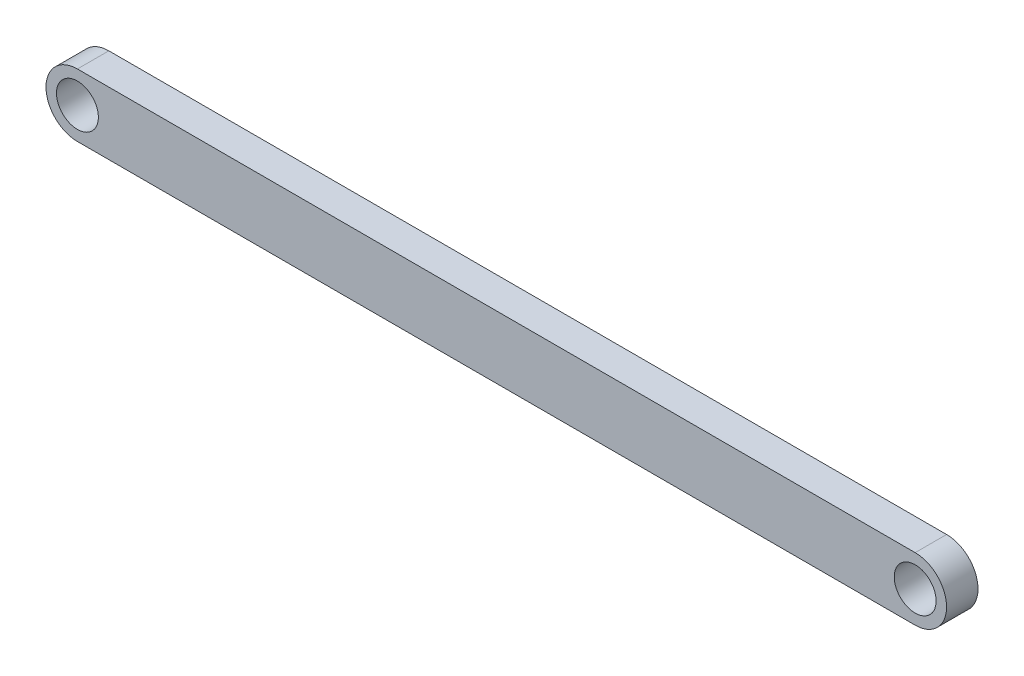
ISO-10303-21;
HEADER;
FILE_DESCRIPTION(('STEP AP214'),'2;1');
FILE_NAME('part.step','',(''),(''),'','','');
FILE_SCHEMA(('AUTOMOTIVE_DESIGN { 1 0 10303 214 1 1 1 1 }'));
ENDSEC;
DATA;
#1=APPLICATION_CONTEXT('core data for automotive mechanical design processes');
#2=APPLICATION_PROTOCOL_DEFINITION('international standard','automotive_design',2000,#1);
#3=PRODUCT_CONTEXT('',#1,'mechanical');
#4=PRODUCT('Part','Part','',(#3));
#5=PRODUCT_RELATED_PRODUCT_CATEGORY('part','',(#4));
#6=PRODUCT_DEFINITION_FORMATION('','',#4);
#7=PRODUCT_DEFINITION_CONTEXT('part definition',#1,'design');
#8=PRODUCT_DEFINITION('design','',#6,#7);
#9=PRODUCT_DEFINITION_SHAPE('','',#8);
#10=(LENGTH_UNIT() NAMED_UNIT(*) SI_UNIT(.MILLI.,.METRE.));
#11=(NAMED_UNIT(*) PLANE_ANGLE_UNIT() SI_UNIT($,.RADIAN.));
#12=(NAMED_UNIT(*) SI_UNIT($,.STERADIAN.) SOLID_ANGLE_UNIT());
#13=UNCERTAINTY_MEASURE_WITH_UNIT(LENGTH_MEASURE(1.E-05),#10,'distance_accuracy_value','');
#14=(GEOMETRIC_REPRESENTATION_CONTEXT(3) GLOBAL_UNCERTAINTY_ASSIGNED_CONTEXT((#13)) GLOBAL_UNIT_ASSIGNED_CONTEXT((#10,
#11,#12)) REPRESENTATION_CONTEXT('',''));
#15=CARTESIAN_POINT('',(0.,0.,0.));
#16=DIRECTION('',(0.,0.,1.));
#17=DIRECTION('',(1.,0.,0.));
#18=AXIS2_PLACEMENT_3D('',#15,#16,#17);
#19=CARTESIAN_POINT('',(-400.,0.,15.));
#20=DIRECTION('',(0.,0.,-1.));
#21=DIRECTION('',(-1.,0.,0.));
#22=AXIS2_PLACEMENT_3D('',#19,#20,#21);
#23=PLANE('',#22);
#24=CARTESIAN_POINT('',(-400.,0.,15.));
#25=DIRECTION('',(0.,0.,1.));
#26=DIRECTION('',(1.,0.,0.));
#27=AXIS2_PLACEMENT_3D('',#24,#25,#26);
#28=CIRCLE('',#27,9.99999999999998);
#29=CARTESIAN_POINT('',(-390.,0.,15.));
#30=VERTEX_POINT('',#29);
#31=EDGE_CURVE('E90',#30,#30,#28,.T.);
#32=ORIENTED_EDGE('',*,*,#31,.F.);
#33=EDGE_LOOP('',(#32));
#34=FACE_BOUND('',#33,.T.);
#35=CARTESIAN_POINT('',(-400.,0.,15.));
#36=DIRECTION('',(0.,0.,1.));
#37=DIRECTION('',(-1.,0.,0.));
#38=AXIS2_PLACEMENT_3D('',#35,#36,#37);
#39=CIRCLE('',#38,15.);
#40=CARTESIAN_POINT('',(-400.,15.,15.));
#41=VERTEX_POINT('',#40);
#42=CARTESIAN_POINT('',(-400.,-15.,15.));
#43=VERTEX_POINT('',#42);
#44=EDGE_CURVE('E100',#41,#43,#39,.T.);
#45=ORIENTED_EDGE('',*,*,#44,.T.);
#46=DIRECTION('',(1.,0.,0.));
#47=VECTOR('',#46,1.);
#48=CARTESIAN_POINT('',(-400.,-15.,15.));
#49=LINE('',#48,#47);
#50=CARTESIAN_POINT('',(0.,-15.,15.));
#51=VERTEX_POINT('',#50);
#52=EDGE_CURVE('E85',#43,#51,#49,.T.);
#53=ORIENTED_EDGE('',*,*,#52,.T.);
#54=CARTESIAN_POINT('',(0.,0.,15.));
#55=DIRECTION('',(0.,0.,1.));
#56=DIRECTION('',(1.,0.,0.));
#57=AXIS2_PLACEMENT_3D('',#54,#55,#56);
#58=CIRCLE('',#57,15.);
#59=CARTESIAN_POINT('',(0.,15.,15.));
#60=VERTEX_POINT('',#59);
#61=EDGE_CURVE('E51',#51,#60,#58,.T.);
#62=ORIENTED_EDGE('',*,*,#61,.T.);
#63=DIRECTION('',(-1.,0.,0.));
#64=VECTOR('',#63,1.);
#65=CARTESIAN_POINT('',(-400.,15.,15.));
#66=LINE('',#65,#64);
#67=EDGE_CURVE('E46',#60,#41,#66,.T.);
#68=ORIENTED_EDGE('',*,*,#67,.T.);
#69=EDGE_LOOP('',(#45,#53,#62,#68));
#70=FACE_BOUND('',#69,.T.);
#71=CARTESIAN_POINT('',(0.,0.,15.));
#72=DIRECTION('',(0.,0.,1.));
#73=DIRECTION('',(1.,0.,0.));
#74=AXIS2_PLACEMENT_3D('',#71,#72,#73);
#75=CIRCLE('',#74,10.);
#76=CARTESIAN_POINT('',(10.,0.,15.));
#77=VERTEX_POINT('',#76);
#78=EDGE_CURVE('E118',#77,#77,#75,.T.);
#79=ORIENTED_EDGE('',*,*,#78,.F.);
#80=EDGE_LOOP('',(#79));
#81=FACE_BOUND('',#80,.T.);
#82=ADVANCED_FACE('F31',(#34,#70,#81),#23,.F.);
#83=CARTESIAN_POINT('',(-400.,0.,0.));
#84=DIRECTION('',(0.,0.,-1.));
#85=DIRECTION('',(-1.,0.,0.));
#86=AXIS2_PLACEMENT_3D('',#83,#84,#85);
#87=PLANE('',#86);
#88=CARTESIAN_POINT('',(-400.,0.,0.));
#89=DIRECTION('',(0.,0.,1.));
#90=DIRECTION('',(1.,0.,0.));
#91=AXIS2_PLACEMENT_3D('',#88,#89,#90);
#92=CIRCLE('',#91,9.99999999999998);
#93=CARTESIAN_POINT('',(-390.,0.,0.));
#94=VERTEX_POINT('',#93);
#95=EDGE_CURVE('E93',#94,#94,#92,.T.);
#96=ORIENTED_EDGE('',*,*,#95,.T.);
#97=EDGE_LOOP('',(#96));
#98=FACE_BOUND('',#97,.T.);
#99=CARTESIAN_POINT('',(-400.,0.,0.));
#100=DIRECTION('',(0.,0.,1.));
#101=DIRECTION('',(-1.,0.,0.));
#102=AXIS2_PLACEMENT_3D('',#99,#100,#101);
#103=CIRCLE('',#102,15.);
#104=CARTESIAN_POINT('',(-400.,15.,0.));
#105=VERTEX_POINT('',#104);
#106=CARTESIAN_POINT('',(-400.,-15.,0.));
#107=VERTEX_POINT('',#106);
#108=EDGE_CURVE('E77',#105,#107,#103,.T.);
#109=ORIENTED_EDGE('',*,*,#108,.F.);
#110=DIRECTION('',(-1.,0.,0.));
#111=VECTOR('',#110,1.);
#112=CARTESIAN_POINT('',(-400.,15.,0.));
#113=LINE('',#112,#111);
#114=CARTESIAN_POINT('',(0.,15.,0.));
#115=VERTEX_POINT('',#114);
#116=EDGE_CURVE('E98',#115,#105,#113,.T.);
#117=ORIENTED_EDGE('',*,*,#116,.F.);
#118=CARTESIAN_POINT('',(0.,0.,0.));
#119=DIRECTION('',(0.,0.,1.));
#120=DIRECTION('',(1.,0.,0.));
#121=AXIS2_PLACEMENT_3D('',#118,#119,#120);
#122=CIRCLE('',#121,15.);
#123=CARTESIAN_POINT('',(0.,-15.,0.));
#124=VERTEX_POINT('',#123);
#125=EDGE_CURVE('E78',#124,#115,#122,.T.);
#126=ORIENTED_EDGE('',*,*,#125,.F.);
#127=DIRECTION('',(1.,0.,0.));
#128=VECTOR('',#127,1.);
#129=CARTESIAN_POINT('',(-400.,-15.,0.));
#130=LINE('',#129,#128);
#131=EDGE_CURVE('E72',#107,#124,#130,.T.);
#132=ORIENTED_EDGE('',*,*,#131,.F.);
#133=EDGE_LOOP('',(#109,#117,#126,#132));
#134=FACE_BOUND('',#133,.T.);
#135=CARTESIAN_POINT('',(0.,0.,0.));
#136=DIRECTION('',(0.,0.,1.));
#137=DIRECTION('',(1.,0.,0.));
#138=AXIS2_PLACEMENT_3D('',#135,#136,#137);
#139=CIRCLE('',#138,10.);
#140=CARTESIAN_POINT('',(10.,0.,0.));
#141=VERTEX_POINT('',#140);
#142=EDGE_CURVE('E120',#141,#141,#139,.T.);
#143=ORIENTED_EDGE('',*,*,#142,.T.);
#144=EDGE_LOOP('',(#143));
#145=FACE_BOUND('',#144,.T.);
#146=ADVANCED_FACE('F73',(#98,#134,#145),#87,.T.);
#147=CARTESIAN_POINT('',(-400.,0.,15.));
#148=DIRECTION('',(0.,0.,-1.));
#149=DIRECTION('',(-1.,0.,0.));
#150=AXIS2_PLACEMENT_3D('',#147,#148,#149);
#151=CYLINDRICAL_SURFACE('',#150,15.);
#152=ORIENTED_EDGE('',*,*,#108,.T.);
#153=DIRECTION('',(0.,0.,-1.));
#154=VECTOR('',#153,1.);
#155=CARTESIAN_POINT('',(-400.,-15.,15.));
#156=LINE('',#155,#154);
#157=EDGE_CURVE('E11',#43,#107,#156,.T.);
#158=ORIENTED_EDGE('',*,*,#157,.F.);
#159=ORIENTED_EDGE('',*,*,#44,.F.);
#160=DIRECTION('',(0.,0.,-1.));
#161=VECTOR('',#160,1.);
#162=CARTESIAN_POINT('',(-400.,15.,15.));
#163=LINE('',#162,#161);
#164=EDGE_CURVE('E89',#41,#105,#163,.T.);
#165=ORIENTED_EDGE('',*,*,#164,.T.);
#166=EDGE_LOOP('',(#152,#158,#159,#165));
#167=FACE_BOUND('',#166,.T.);
#168=ADVANCED_FACE('F33',(#167),#151,.T.);
#169=CARTESIAN_POINT('',(-400.,-15.,15.));
#170=DIRECTION('',(0.,1.,0.));
#171=DIRECTION('',(-1.,0.,0.));
#172=AXIS2_PLACEMENT_3D('',#169,#170,#171);
#173=PLANE('',#172);
#174=ORIENTED_EDGE('',*,*,#131,.T.);
#175=DIRECTION('',(0.,0.,-1.));
#176=VECTOR('',#175,1.);
#177=CARTESIAN_POINT('',(0.,-15.,15.));
#178=LINE('',#177,#176);
#179=EDGE_CURVE('E39',#51,#124,#178,.T.);
#180=ORIENTED_EDGE('',*,*,#179,.F.);
#181=ORIENTED_EDGE('',*,*,#52,.F.);
#182=ORIENTED_EDGE('',*,*,#157,.T.);
#183=EDGE_LOOP('',(#174,#180,#181,#182));
#184=FACE_BOUND('',#183,.T.);
#185=ADVANCED_FACE('F84',(#184),#173,.F.);
#186=CARTESIAN_POINT('',(0.,0.,15.));
#187=DIRECTION('',(0.,0.,-1.));
#188=DIRECTION('',(-1.,0.,0.));
#189=AXIS2_PLACEMENT_3D('',#186,#187,#188);
#190=CYLINDRICAL_SURFACE('',#189,15.);
#191=ORIENTED_EDGE('',*,*,#125,.T.);
#192=DIRECTION('',(0.,0.,-1.));
#193=VECTOR('',#192,1.);
#194=CARTESIAN_POINT('',(0.,15.,15.));
#195=LINE('',#194,#193);
#196=EDGE_CURVE('E106',#60,#115,#195,.T.);
#197=ORIENTED_EDGE('',*,*,#196,.F.);
#198=ORIENTED_EDGE('',*,*,#61,.F.);
#199=ORIENTED_EDGE('',*,*,#179,.T.);
#200=EDGE_LOOP('',(#191,#197,#198,#199));
#201=FACE_BOUND('',#200,.T.);
#202=ADVANCED_FACE('F109',(#201),#190,.T.);
#203=CARTESIAN_POINT('',(-400.,15.,15.));
#204=DIRECTION('',(0.,-1.,0.));
#205=DIRECTION('',(0.,0.,-1.));
#206=AXIS2_PLACEMENT_3D('',#203,#204,#205);
#207=PLANE('',#206);
#208=ORIENTED_EDGE('',*,*,#116,.T.);
#209=ORIENTED_EDGE('',*,*,#164,.F.);
#210=ORIENTED_EDGE('',*,*,#67,.F.);
#211=ORIENTED_EDGE('',*,*,#196,.T.);
#212=EDGE_LOOP('',(#208,#209,#210,#211));
#213=FACE_BOUND('',#212,.T.);
#214=ADVANCED_FACE('F111',(#213),#207,.F.);
#215=CARTESIAN_POINT('',(-400.,0.,15.));
#216=DIRECTION('',(0.,0.,-1.));
#217=DIRECTION('',(-1.,0.,0.));
#218=AXIS2_PLACEMENT_3D('',#215,#216,#217);
#219=CYLINDRICAL_SURFACE('',#218,9.99999999999998);
#220=ORIENTED_EDGE('',*,*,#31,.T.);
#221=EDGE_LOOP('',(#220));
#222=FACE_BOUND('',#221,.T.);
#223=ORIENTED_EDGE('',*,*,#95,.F.);
#224=EDGE_LOOP('',(#223));
#225=FACE_BOUND('',#224,.T.);
#226=ADVANCED_FACE('F129',(#222,#225),#219,.F.);
#227=CARTESIAN_POINT('',(0.,0.,15.));
#228=DIRECTION('',(0.,0.,-1.));
#229=DIRECTION('',(-1.,0.,0.));
#230=AXIS2_PLACEMENT_3D('',#227,#228,#229);
#231=CYLINDRICAL_SURFACE('',#230,10.);
#232=ORIENTED_EDGE('',*,*,#78,.T.);
#233=EDGE_LOOP('',(#232));
#234=FACE_BOUND('',#233,.T.);
#235=ORIENTED_EDGE('',*,*,#142,.F.);
#236=EDGE_LOOP('',(#235));
#237=FACE_BOUND('',#236,.T.);
#238=ADVANCED_FACE('F127',(#234,#237),#231,.F.);
#239=CLOSED_SHELL('',(#82,#146,#168,#185,#202,#214,#226,#238));
#240=MANIFOLD_SOLID_BREP('B2',#239);
#241=ADVANCED_BREP_SHAPE_REPRESENTATION('',(#18,#240),#14);
#242=SHAPE_DEFINITION_REPRESENTATION(#9,#241);
ENDSEC;
END-ISO-10303-21;
